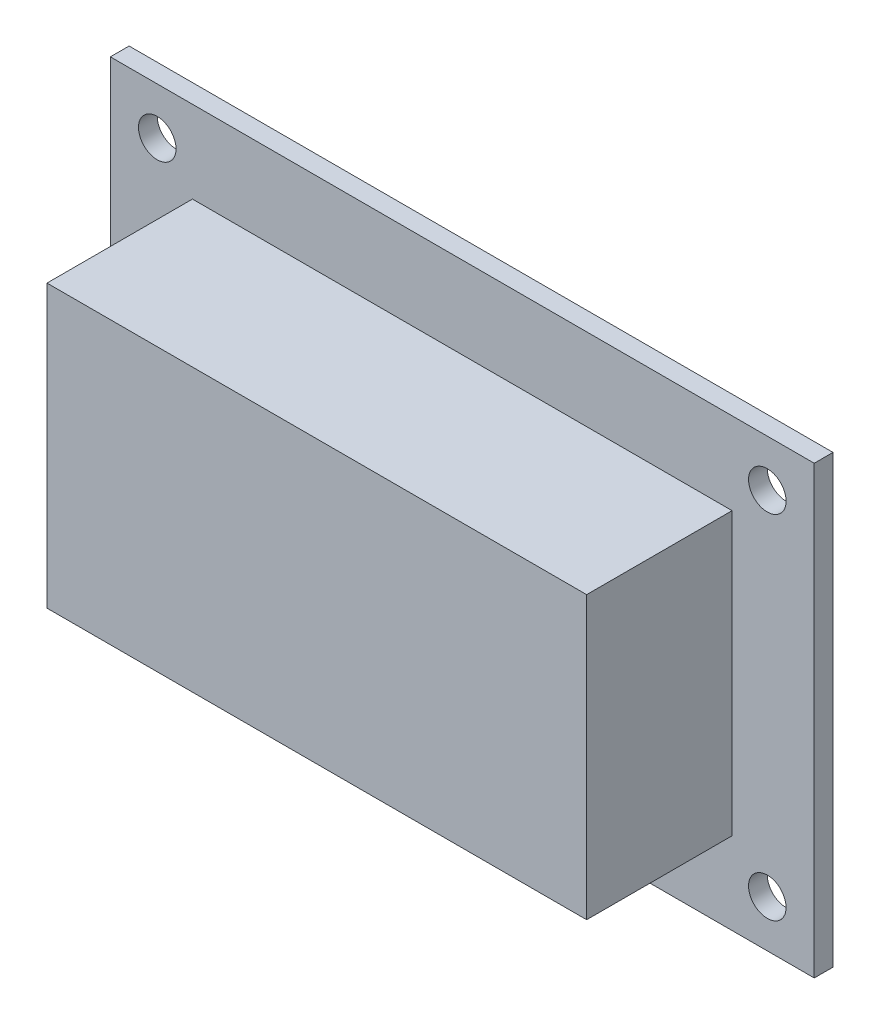
ISO-10303-21;
HEADER;
FILE_DESCRIPTION(('STEP AP214'),'2;1');
FILE_NAME('part.step','',(''),(''),'','','');
FILE_SCHEMA(('AUTOMOTIVE_DESIGN { 1 0 10303 214 1 1 1 1 }'));
ENDSEC;
DATA;
#1=APPLICATION_CONTEXT('core data for automotive mechanical design processes');
#2=APPLICATION_PROTOCOL_DEFINITION('international standard','automotive_design',2000,#1);
#3=PRODUCT_CONTEXT('',#1,'mechanical');
#4=PRODUCT('Part','Part','',(#3));
#5=PRODUCT_RELATED_PRODUCT_CATEGORY('part','',(#4));
#6=PRODUCT_DEFINITION_FORMATION('','',#4);
#7=PRODUCT_DEFINITION_CONTEXT('part definition',#1,'design');
#8=PRODUCT_DEFINITION('design','',#6,#7);
#9=PRODUCT_DEFINITION_SHAPE('','',#8);
#10=(LENGTH_UNIT() NAMED_UNIT(*) SI_UNIT(.MILLI.,.METRE.));
#11=(NAMED_UNIT(*) PLANE_ANGLE_UNIT() SI_UNIT($,.RADIAN.));
#12=(NAMED_UNIT(*) SI_UNIT($,.STERADIAN.) SOLID_ANGLE_UNIT());
#13=UNCERTAINTY_MEASURE_WITH_UNIT(LENGTH_MEASURE(1.E-05),#10,'distance_accuracy_value','');
#14=(GEOMETRIC_REPRESENTATION_CONTEXT(3) GLOBAL_UNCERTAINTY_ASSIGNED_CONTEXT((#13)) GLOBAL_UNIT_ASSIGNED_CONTEXT((#10,
#11,#12)) REPRESENTATION_CONTEXT('',''));
#15=CARTESIAN_POINT('',(0.,0.,0.));
#16=DIRECTION('',(0.,0.,1.));
#17=DIRECTION('',(1.,0.,0.));
#18=AXIS2_PLACEMENT_3D('',#15,#16,#17);
#19=CARTESIAN_POINT('',(-23.,-12.,14.));
#20=DIRECTION('',(0.,0.,1.));
#21=DIRECTION('',(1.,0.,0.));
#22=AXIS2_PLACEMENT_3D('',#19,#20,#21);
#23=PLANE('',#22);
#24=DIRECTION('',(0.,1.,0.));
#25=VECTOR('',#24,1.);
#26=CARTESIAN_POINT('',(-23.,-12.,14.));
#27=LINE('',#26,#25);
#28=CARTESIAN_POINT('',(-23.,-12.,14.));
#29=VERTEX_POINT('',#28);
#30=CARTESIAN_POINT('',(-23.,12.,14.));
#31=VERTEX_POINT('',#30);
#32=EDGE_CURVE('E181',#29,#31,#27,.T.);
#33=ORIENTED_EDGE('',*,*,#32,.F.);
#34=DIRECTION('',(1.,0.,0.));
#35=VECTOR('',#34,1.);
#36=CARTESIAN_POINT('',(-23.,-12.,14.));
#37=LINE('',#36,#35);
#38=CARTESIAN_POINT('',(23.,-12.,14.));
#39=VERTEX_POINT('',#38);
#40=EDGE_CURVE('E207',#29,#39,#37,.T.);
#41=ORIENTED_EDGE('',*,*,#40,.T.);
#42=DIRECTION('',(0.,1.,0.));
#43=VECTOR('',#42,1.);
#44=CARTESIAN_POINT('',(23.,-12.,14.));
#45=LINE('',#44,#43);
#46=CARTESIAN_POINT('',(23.,12.,14.));
#47=VERTEX_POINT('',#46);
#48=EDGE_CURVE('E182',#39,#47,#45,.T.);
#49=ORIENTED_EDGE('',*,*,#48,.T.);
#50=DIRECTION('',(1.,0.,0.));
#51=VECTOR('',#50,1.);
#52=CARTESIAN_POINT('',(-23.,12.,14.));
#53=LINE('',#52,#51);
#54=EDGE_CURVE('E25',#31,#47,#53,.T.);
#55=ORIENTED_EDGE('',*,*,#54,.F.);
#56=EDGE_LOOP('',(#33,#41,#49,#55));
#57=FACE_BOUND('',#56,.T.);
#58=ADVANCED_FACE('F14',(#57),#23,.T.);
#59=CARTESIAN_POINT('',(26.,15.,-2.5));
#60=DIRECTION('',(0.,0.,1.));
#61=DIRECTION('',(1.,0.,0.));
#62=AXIS2_PLACEMENT_3D('',#59,#60,#61);
#63=CYLINDRICAL_SURFACE('',#62,1.6);
#64=DIRECTION('',(0.,0.,1.));
#65=VECTOR('',#64,1.);
#66=CARTESIAN_POINT('',(27.6,15.,-2.5));
#67=LINE('',#66,#65);
#68=CARTESIAN_POINT('',(27.6,15.,0.));
#69=VERTEX_POINT('',#68);
#70=CARTESIAN_POINT('',(27.6,15.,1.6));
#71=VERTEX_POINT('',#70);
#72=EDGE_CURVE('E9',#69,#71,#67,.T.);
#73=ORIENTED_EDGE('',*,*,#72,.F.);
#74=CARTESIAN_POINT('',(26.,15.,0.));
#75=DIRECTION('',(0.,0.,1.));
#76=DIRECTION('',(1.,0.,0.));
#77=AXIS2_PLACEMENT_3D('',#74,#75,#76);
#78=CIRCLE('',#77,1.6);
#79=EDGE_CURVE('E198',#69,#69,#78,.T.);
#80=ORIENTED_EDGE('',*,*,#79,.F.);
#81=ORIENTED_EDGE('',*,*,#72,.T.);
#82=CARTESIAN_POINT('',(26.,15.,1.6));
#83=DIRECTION('',(0.,0.,1.));
#84=DIRECTION('',(1.,0.,0.));
#85=AXIS2_PLACEMENT_3D('',#82,#83,#84);
#86=CIRCLE('',#85,1.6);
#87=EDGE_CURVE('E216',#71,#71,#86,.T.);
#88=ORIENTED_EDGE('',*,*,#87,.T.);
#89=EDGE_LOOP('',(#73,#80,#81,#88));
#90=FACE_BOUND('',#89,.T.);
#91=ADVANCED_FACE('F419',(#90),#63,.F.);
#92=CARTESIAN_POINT('',(-23.,12.,1.6));
#93=DIRECTION('',(0.,1.,0.));
#94=DIRECTION('',(1.,0.,0.));
#95=AXIS2_PLACEMENT_3D('',#92,#93,#94);
#96=PLANE('',#95);
#97=DIRECTION('',(1.,0.,0.));
#98=VECTOR('',#97,1.);
#99=CARTESIAN_POINT('',(-23.,12.,1.6));
#100=LINE('',#99,#98);
#101=CARTESIAN_POINT('',(-23.,12.,1.6));
#102=VERTEX_POINT('',#101);
#103=CARTESIAN_POINT('',(23.,12.,1.6));
#104=VERTEX_POINT('',#103);
#105=EDGE_CURVE('E234',#102,#104,#100,.T.);
#106=ORIENTED_EDGE('',*,*,#105,.F.);
#107=DIRECTION('',(0.,0.,1.));
#108=VECTOR('',#107,1.);
#109=CARTESIAN_POINT('',(-23.,12.,1.6));
#110=LINE('',#109,#108);
#111=EDGE_CURVE('E178',#102,#31,#110,.T.);
#112=ORIENTED_EDGE('',*,*,#111,.T.);
#113=ORIENTED_EDGE('',*,*,#54,.T.);
#114=DIRECTION('',(0.,0.,1.));
#115=VECTOR('',#114,1.);
#116=CARTESIAN_POINT('',(23.,12.,1.6));
#117=LINE('',#116,#115);
#118=EDGE_CURVE('E185',#104,#47,#117,.T.);
#119=ORIENTED_EDGE('',*,*,#118,.F.);
#120=EDGE_LOOP('',(#106,#112,#113,#119));
#121=FACE_BOUND('',#120,.T.);
#122=ADVANCED_FACE('F423',(#121),#96,.T.);
#123=CARTESIAN_POINT('',(23.,-12.,1.6));
#124=DIRECTION('',(1.,0.,0.));
#125=DIRECTION('',(0.,1.,0.));
#126=AXIS2_PLACEMENT_3D('',#123,#124,#125);
#127=PLANE('',#126);
#128=DIRECTION('',(0.,0.,1.));
#129=VECTOR('',#128,1.);
#130=CARTESIAN_POINT('',(23.,-12.,1.6));
#131=LINE('',#130,#129);
#132=CARTESIAN_POINT('',(23.,-12.,1.6));
#133=VERTEX_POINT('',#132);
#134=EDGE_CURVE('E203',#133,#39,#131,.T.);
#135=ORIENTED_EDGE('',*,*,#134,.F.);
#136=DIRECTION('',(0.,1.,0.));
#137=VECTOR('',#136,1.);
#138=CARTESIAN_POINT('',(23.,-12.,1.6));
#139=LINE('',#138,#137);
#140=EDGE_CURVE('E239',#133,#104,#139,.T.);
#141=ORIENTED_EDGE('',*,*,#140,.T.);
#142=ORIENTED_EDGE('',*,*,#118,.T.);
#143=ORIENTED_EDGE('',*,*,#48,.F.);
#144=EDGE_LOOP('',(#135,#141,#142,#143));
#145=FACE_BOUND('',#144,.T.);
#146=ADVANCED_FACE('F432',(#145),#127,.T.);
#147=CARTESIAN_POINT('',(-23.,-12.,1.6));
#148=DIRECTION('',(0.,1.,0.));
#149=DIRECTION('',(1.,0.,0.));
#150=AXIS2_PLACEMENT_3D('',#147,#148,#149);
#151=PLANE('',#150);
#152=ORIENTED_EDGE('',*,*,#134,.T.);
#153=ORIENTED_EDGE('',*,*,#40,.F.);
#154=DIRECTION('',(0.,0.,1.));
#155=VECTOR('',#154,1.);
#156=CARTESIAN_POINT('',(-23.,-12.,1.6));
#157=LINE('',#156,#155);
#158=CARTESIAN_POINT('',(-23.,-12.,1.6));
#159=VERTEX_POINT('',#158);
#160=EDGE_CURVE('E75',#159,#29,#157,.T.);
#161=ORIENTED_EDGE('',*,*,#160,.F.);
#162=DIRECTION('',(1.,0.,0.));
#163=VECTOR('',#162,1.);
#164=CARTESIAN_POINT('',(-23.,-12.,1.6));
#165=LINE('',#164,#163);
#166=EDGE_CURVE('E220',#159,#133,#165,.T.);
#167=ORIENTED_EDGE('',*,*,#166,.T.);
#168=EDGE_LOOP('',(#152,#153,#161,#167));
#169=FACE_BOUND('',#168,.T.);
#170=ADVANCED_FACE('F413',(#169),#151,.F.);
#171=CARTESIAN_POINT('',(-23.,-12.,1.6));
#172=DIRECTION('',(1.,0.,0.));
#173=DIRECTION('',(0.,1.,0.));
#174=AXIS2_PLACEMENT_3D('',#171,#172,#173);
#175=PLANE('',#174);
#176=ORIENTED_EDGE('',*,*,#32,.T.);
#177=ORIENTED_EDGE('',*,*,#111,.F.);
#178=DIRECTION('',(0.,1.,0.));
#179=VECTOR('',#178,1.);
#180=CARTESIAN_POINT('',(-23.,-12.,1.6));
#181=LINE('',#180,#179);
#182=EDGE_CURVE('E230',#159,#102,#181,.T.);
#183=ORIENTED_EDGE('',*,*,#182,.F.);
#184=ORIENTED_EDGE('',*,*,#160,.T.);
#185=EDGE_LOOP('',(#176,#177,#183,#184));
#186=FACE_BOUND('',#185,.T.);
#187=ADVANCED_FACE('F409',(#186),#175,.F.);
#188=CARTESIAN_POINT('',(-26.,15.,-2.5));
#189=DIRECTION('',(0.,0.,1.));
#190=DIRECTION('',(1.,0.,0.));
#191=AXIS2_PLACEMENT_3D('',#188,#189,#190);
#192=CYLINDRICAL_SURFACE('',#191,1.6);
#193=DIRECTION('',(0.,0.,1.));
#194=VECTOR('',#193,1.);
#195=CARTESIAN_POINT('',(-24.4,15.,-2.5));
#196=LINE('',#195,#194);
#197=CARTESIAN_POINT('',(-24.4,15.,0.));
#198=VERTEX_POINT('',#197);
#199=CARTESIAN_POINT('',(-24.4,15.,1.6));
#200=VERTEX_POINT('',#199);
#201=EDGE_CURVE('E88',#198,#200,#196,.T.);
#202=ORIENTED_EDGE('',*,*,#201,.F.);
#203=CARTESIAN_POINT('',(-26.,15.,0.));
#204=DIRECTION('',(0.,0.,1.));
#205=DIRECTION('',(1.,0.,0.));
#206=AXIS2_PLACEMENT_3D('',#203,#204,#205);
#207=CIRCLE('',#206,1.6);
#208=EDGE_CURVE('E194',#198,#198,#207,.T.);
#209=ORIENTED_EDGE('',*,*,#208,.F.);
#210=ORIENTED_EDGE('',*,*,#201,.T.);
#211=CARTESIAN_POINT('',(-26.,15.,1.6));
#212=DIRECTION('',(0.,0.,1.));
#213=DIRECTION('',(1.,0.,0.));
#214=AXIS2_PLACEMENT_3D('',#211,#212,#213);
#215=CIRCLE('',#214,1.6);
#216=EDGE_CURVE('E235',#200,#200,#215,.T.);
#217=ORIENTED_EDGE('',*,*,#216,.T.);
#218=EDGE_LOOP('',(#202,#209,#210,#217));
#219=FACE_BOUND('',#218,.T.);
#220=ADVANCED_FACE('F260',(#219),#192,.F.);
#221=CARTESIAN_POINT('',(26.,-15.,-2.5));
#222=DIRECTION('',(0.,0.,1.));
#223=DIRECTION('',(1.,0.,0.));
#224=AXIS2_PLACEMENT_3D('',#221,#222,#223);
#225=CYLINDRICAL_SURFACE('',#224,1.6);
#226=DIRECTION('',(0.,0.,1.));
#227=VECTOR('',#226,1.);
#228=CARTESIAN_POINT('',(27.6,-15.,-2.5));
#229=LINE('',#228,#227);
#230=CARTESIAN_POINT('',(27.6,-15.,0.));
#231=VERTEX_POINT('',#230);
#232=CARTESIAN_POINT('',(27.6,-15.,1.6));
#233=VERTEX_POINT('',#232);
#234=EDGE_CURVE('E100',#231,#233,#229,.T.);
#235=ORIENTED_EDGE('',*,*,#234,.F.);
#236=CARTESIAN_POINT('',(26.,-15.,0.));
#237=DIRECTION('',(0.,0.,1.));
#238=DIRECTION('',(1.,0.,0.));
#239=AXIS2_PLACEMENT_3D('',#236,#237,#238);
#240=CIRCLE('',#239,1.6);
#241=EDGE_CURVE('E199',#231,#231,#240,.T.);
#242=ORIENTED_EDGE('',*,*,#241,.F.);
#243=ORIENTED_EDGE('',*,*,#234,.T.);
#244=CARTESIAN_POINT('',(26.,-15.,1.6));
#245=DIRECTION('',(0.,0.,1.));
#246=DIRECTION('',(1.,0.,0.));
#247=AXIS2_PLACEMENT_3D('',#244,#245,#246);
#248=CIRCLE('',#247,1.6);
#249=EDGE_CURVE('E251',#233,#233,#248,.T.);
#250=ORIENTED_EDGE('',*,*,#249,.T.);
#251=EDGE_LOOP('',(#235,#242,#243,#250));
#252=FACE_BOUND('',#251,.T.);
#253=ADVANCED_FACE('F437',(#252),#225,.F.);
#254=CARTESIAN_POINT('',(-26.,-15.,-2.5));
#255=DIRECTION('',(0.,0.,1.));
#256=DIRECTION('',(1.,0.,0.));
#257=AXIS2_PLACEMENT_3D('',#254,#255,#256);
#258=CYLINDRICAL_SURFACE('',#257,1.6);
#259=DIRECTION('',(0.,0.,1.));
#260=VECTOR('',#259,1.);
#261=CARTESIAN_POINT('',(-24.4,-15.,-2.5));
#262=LINE('',#261,#260);
#263=CARTESIAN_POINT('',(-24.4,-15.,0.));
#264=VERTEX_POINT('',#263);
#265=CARTESIAN_POINT('',(-24.4,-15.,1.6));
#266=VERTEX_POINT('',#265);
#267=EDGE_CURVE('E227',#264,#266,#262,.T.);
#268=ORIENTED_EDGE('',*,*,#267,.F.);
#269=CARTESIAN_POINT('',(-26.,-15.,0.));
#270=DIRECTION('',(0.,0.,1.));
#271=DIRECTION('',(1.,0.,0.));
#272=AXIS2_PLACEMENT_3D('',#269,#270,#271);
#273=CIRCLE('',#272,1.6);
#274=EDGE_CURVE('E193',#264,#264,#273,.T.);
#275=ORIENTED_EDGE('',*,*,#274,.F.);
#276=ORIENTED_EDGE('',*,*,#267,.T.);
#277=CARTESIAN_POINT('',(-26.,-15.,1.6));
#278=DIRECTION('',(0.,0.,1.));
#279=DIRECTION('',(1.,0.,0.));
#280=AXIS2_PLACEMENT_3D('',#277,#278,#279);
#281=CIRCLE('',#280,1.6);
#282=EDGE_CURVE('E157',#266,#266,#281,.T.);
#283=ORIENTED_EDGE('',*,*,#282,.T.);
#284=EDGE_LOOP('',(#268,#275,#276,#283));
#285=FACE_BOUND('',#284,.T.);
#286=ADVANCED_FACE('F405',(#285),#258,.F.);
#287=CARTESIAN_POINT('',(30.,-19.,0.));
#288=DIRECTION('',(1.,0.,0.));
#289=DIRECTION('',(0.,1.,0.));
#290=AXIS2_PLACEMENT_3D('',#287,#288,#289);
#291=PLANE('',#290);
#292=DIRECTION('',(0.,0.,1.));
#293=VECTOR('',#292,1.);
#294=CARTESIAN_POINT('',(30.,-19.,0.));
#295=LINE('',#294,#293);
#296=CARTESIAN_POINT('',(30.,-19.,0.));
#297=VERTEX_POINT('',#296);
#298=CARTESIAN_POINT('',(30.,-19.,1.6));
#299=VERTEX_POINT('',#298);
#300=EDGE_CURVE('E18',#297,#299,#295,.T.);
#301=ORIENTED_EDGE('',*,*,#300,.F.);
#302=DIRECTION('',(0.,1.,0.));
#303=VECTOR('',#302,1.);
#304=CARTESIAN_POINT('',(30.,-19.,0.));
#305=LINE('',#304,#303);
#306=CARTESIAN_POINT('',(30.,19.,0.));
#307=VERTEX_POINT('',#306);
#308=EDGE_CURVE('E189',#297,#307,#305,.T.);
#309=ORIENTED_EDGE('',*,*,#308,.T.);
#310=DIRECTION('',(0.,0.,1.));
#311=VECTOR('',#310,1.);
#312=CARTESIAN_POINT('',(30.,19.,0.));
#313=LINE('',#312,#311);
#314=CARTESIAN_POINT('',(30.,19.,1.6));
#315=VERTEX_POINT('',#314);
#316=EDGE_CURVE('E186',#307,#315,#313,.T.);
#317=ORIENTED_EDGE('',*,*,#316,.T.);
#318=DIRECTION('',(0.,1.,0.));
#319=VECTOR('',#318,1.);
#320=CARTESIAN_POINT('',(30.,-19.,1.6));
#321=LINE('',#320,#319);
#322=EDGE_CURVE('E155',#299,#315,#321,.T.);
#323=ORIENTED_EDGE('',*,*,#322,.F.);
#324=EDGE_LOOP('',(#301,#309,#317,#323));
#325=FACE_BOUND('',#324,.T.);
#326=ADVANCED_FACE('F297',(#325),#291,.T.);
#327=CARTESIAN_POINT('',(-30.,-19.,0.));
#328=DIRECTION('',(0.,0.,1.));
#329=DIRECTION('',(1.,0.,0.));
#330=AXIS2_PLACEMENT_3D('',#327,#328,#329);
#331=PLANE('',#330);
#332=ORIENTED_EDGE('',*,*,#79,.T.);
#333=EDGE_LOOP('',(#332));
#334=FACE_BOUND('',#333,.T.);
#335=ORIENTED_EDGE('',*,*,#208,.T.);
#336=EDGE_LOOP('',(#335));
#337=FACE_BOUND('',#336,.T.);
#338=ORIENTED_EDGE('',*,*,#241,.T.);
#339=EDGE_LOOP('',(#338));
#340=FACE_BOUND('',#339,.T.);
#341=ORIENTED_EDGE('',*,*,#274,.T.);
#342=EDGE_LOOP('',(#341));
#343=FACE_BOUND('',#342,.T.);
#344=DIRECTION('',(1.,0.,0.));
#345=VECTOR('',#344,1.);
#346=CARTESIAN_POINT('',(-30.,19.,0.));
#347=LINE('',#346,#345);
#348=CARTESIAN_POINT('',(-30.,19.,0.));
#349=VERTEX_POINT('',#348);
#350=EDGE_CURVE('E142',#349,#307,#347,.T.);
#351=ORIENTED_EDGE('',*,*,#350,.T.);
#352=ORIENTED_EDGE('',*,*,#308,.F.);
#353=DIRECTION('',(1.,0.,0.));
#354=VECTOR('',#353,1.);
#355=CARTESIAN_POINT('',(-30.,-19.,0.));
#356=LINE('',#355,#354);
#357=CARTESIAN_POINT('',(-30.,-19.,0.));
#358=VERTEX_POINT('',#357);
#359=EDGE_CURVE('E226',#358,#297,#356,.T.);
#360=ORIENTED_EDGE('',*,*,#359,.F.);
#361=DIRECTION('',(0.,1.,0.));
#362=VECTOR('',#361,1.);
#363=CARTESIAN_POINT('',(-30.,-19.,0.));
#364=LINE('',#363,#362);
#365=EDGE_CURVE('E165',#358,#349,#364,.T.);
#366=ORIENTED_EDGE('',*,*,#365,.T.);
#367=EDGE_LOOP('',(#351,#352,#360,#366));
#368=FACE_BOUND('',#367,.T.);
#369=ADVANCED_FACE('F16',(#334,#337,#340,#343,#368),#331,.F.);
#370=CARTESIAN_POINT('',(-30.,19.,0.));
#371=DIRECTION('',(0.,1.,0.));
#372=DIRECTION('',(1.,0.,0.));
#373=AXIS2_PLACEMENT_3D('',#370,#371,#372);
#374=PLANE('',#373);
#375=ORIENTED_EDGE('',*,*,#350,.F.);
#376=DIRECTION('',(0.,0.,1.));
#377=VECTOR('',#376,1.);
#378=CARTESIAN_POINT('',(-30.,19.,0.));
#379=LINE('',#378,#377);
#380=CARTESIAN_POINT('',(-30.,19.,1.6));
#381=VERTEX_POINT('',#380);
#382=EDGE_CURVE('E160',#349,#381,#379,.T.);
#383=ORIENTED_EDGE('',*,*,#382,.T.);
#384=DIRECTION('',(1.,0.,0.));
#385=VECTOR('',#384,1.);
#386=CARTESIAN_POINT('',(-30.,19.,1.6));
#387=LINE('',#386,#385);
#388=EDGE_CURVE('E150',#381,#315,#387,.T.);
#389=ORIENTED_EDGE('',*,*,#388,.T.);
#390=ORIENTED_EDGE('',*,*,#316,.F.);
#391=EDGE_LOOP('',(#375,#383,#389,#390));
#392=FACE_BOUND('',#391,.T.);
#393=ADVANCED_FACE('F161',(#392),#374,.T.);
#394=CARTESIAN_POINT('',(-30.,-19.,1.6));
#395=DIRECTION('',(0.,0.,1.));
#396=DIRECTION('',(1.,0.,0.));
#397=AXIS2_PLACEMENT_3D('',#394,#395,#396);
#398=PLANE('',#397);
#399=ORIENTED_EDGE('',*,*,#87,.F.);
#400=EDGE_LOOP('',(#399));
#401=FACE_BOUND('',#400,.T.);
#402=ORIENTED_EDGE('',*,*,#182,.T.);
#403=ORIENTED_EDGE('',*,*,#105,.T.);
#404=ORIENTED_EDGE('',*,*,#140,.F.);
#405=ORIENTED_EDGE('',*,*,#166,.F.);
#406=EDGE_LOOP('',(#402,#403,#404,#405));
#407=FACE_BOUND('',#406,.T.);
#408=ORIENTED_EDGE('',*,*,#216,.F.);
#409=EDGE_LOOP('',(#408));
#410=FACE_BOUND('',#409,.T.);
#411=ORIENTED_EDGE('',*,*,#249,.F.);
#412=EDGE_LOOP('',(#411));
#413=FACE_BOUND('',#412,.T.);
#414=ORIENTED_EDGE('',*,*,#282,.F.);
#415=EDGE_LOOP('',(#414));
#416=FACE_BOUND('',#415,.T.);
#417=DIRECTION('',(0.,1.,0.));
#418=VECTOR('',#417,1.);
#419=CARTESIAN_POINT('',(-30.,-19.,1.6));
#420=LINE('',#419,#418);
#421=CARTESIAN_POINT('',(-30.,-19.,1.6));
#422=VERTEX_POINT('',#421);
#423=EDGE_CURVE('E154',#422,#381,#420,.T.);
#424=ORIENTED_EDGE('',*,*,#423,.F.);
#425=DIRECTION('',(1.,0.,0.));
#426=VECTOR('',#425,1.);
#427=CARTESIAN_POINT('',(-30.,-19.,1.6));
#428=LINE('',#427,#426);
#429=EDGE_CURVE('E223',#422,#299,#428,.T.);
#430=ORIENTED_EDGE('',*,*,#429,.T.);
#431=ORIENTED_EDGE('',*,*,#322,.T.);
#432=ORIENTED_EDGE('',*,*,#388,.F.);
#433=EDGE_LOOP('',(#424,#430,#431,#432));
#434=FACE_BOUND('',#433,.T.);
#435=ADVANCED_FACE('F151',(#401,#407,#410,#413,#416,#434),#398,.T.);
#436=CARTESIAN_POINT('',(-30.,-19.,0.));
#437=DIRECTION('',(0.,1.,0.));
#438=DIRECTION('',(1.,0.,0.));
#439=AXIS2_PLACEMENT_3D('',#436,#437,#438);
#440=PLANE('',#439);
#441=ORIENTED_EDGE('',*,*,#300,.T.);
#442=ORIENTED_EDGE('',*,*,#429,.F.);
#443=DIRECTION('',(0.,0.,1.));
#444=VECTOR('',#443,1.);
#445=CARTESIAN_POINT('',(-30.,-19.,0.));
#446=LINE('',#445,#444);
#447=EDGE_CURVE('E170',#358,#422,#446,.T.);
#448=ORIENTED_EDGE('',*,*,#447,.F.);
#449=ORIENTED_EDGE('',*,*,#359,.T.);
#450=EDGE_LOOP('',(#441,#442,#448,#449));
#451=FACE_BOUND('',#450,.T.);
#452=ADVANCED_FACE('F264',(#451),#440,.F.);
#453=CARTESIAN_POINT('',(-30.,-19.,0.));
#454=DIRECTION('',(1.,0.,0.));
#455=DIRECTION('',(0.,1.,0.));
#456=AXIS2_PLACEMENT_3D('',#453,#454,#455);
#457=PLANE('',#456);
#458=ORIENTED_EDGE('',*,*,#423,.T.);
#459=ORIENTED_EDGE('',*,*,#382,.F.);
#460=ORIENTED_EDGE('',*,*,#365,.F.);
#461=ORIENTED_EDGE('',*,*,#447,.T.);
#462=EDGE_LOOP('',(#458,#459,#460,#461));
#463=FACE_BOUND('',#462,.T.);
#464=ADVANCED_FACE('F168',(#463),#457,.F.);
#465=CLOSED_SHELL('',(#58,#91,#122,#146,#170,#187,#220,#253,#286,#326,#369,#393,#435,#452,#464));
#466=MANIFOLD_SOLID_BREP('B1',#465);
#467=ADVANCED_BREP_SHAPE_REPRESENTATION('',(#18,#466),#14);
#468=SHAPE_DEFINITION_REPRESENTATION(#9,#467);
ENDSEC;
END-ISO-10303-21;
